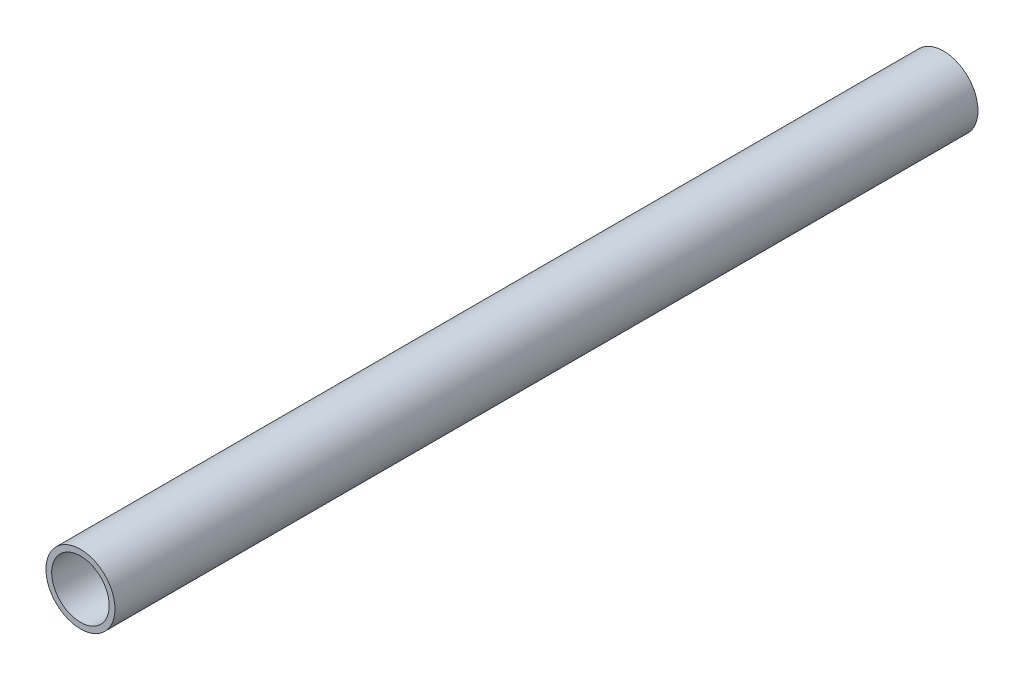
ISO-10303-21;
HEADER;
FILE_DESCRIPTION(('STEP AP214'),'2;1');
FILE_NAME('part.step','',(''),(''),'','','');
FILE_SCHEMA(('AUTOMOTIVE_DESIGN { 1 0 10303 214 1 1 1 1 }'));
ENDSEC;
DATA;
#1=APPLICATION_CONTEXT('core data for automotive mechanical design processes');
#2=APPLICATION_PROTOCOL_DEFINITION('international standard','automotive_design',2000,#1);
#3=PRODUCT_CONTEXT('',#1,'mechanical');
#4=PRODUCT('Part','Part','',(#3));
#5=PRODUCT_RELATED_PRODUCT_CATEGORY('part','',(#4));
#6=PRODUCT_DEFINITION_FORMATION('','',#4);
#7=PRODUCT_DEFINITION_CONTEXT('part definition',#1,'design');
#8=PRODUCT_DEFINITION('design','',#6,#7);
#9=PRODUCT_DEFINITION_SHAPE('','',#8);
#10=(LENGTH_UNIT() NAMED_UNIT(*) SI_UNIT(.MILLI.,.METRE.));
#11=(NAMED_UNIT(*) PLANE_ANGLE_UNIT() SI_UNIT($,.RADIAN.));
#12=(NAMED_UNIT(*) SI_UNIT($,.STERADIAN.) SOLID_ANGLE_UNIT());
#13=UNCERTAINTY_MEASURE_WITH_UNIT(LENGTH_MEASURE(1.E-05),#10,'distance_accuracy_value','');
#14=(GEOMETRIC_REPRESENTATION_CONTEXT(3) GLOBAL_UNCERTAINTY_ASSIGNED_CONTEXT((#13)) GLOBAL_UNIT_ASSIGNED_CONTEXT((#10,
#11,#12)) REPRESENTATION_CONTEXT('',''));
#15=CARTESIAN_POINT('',(0.,0.,0.));
#16=DIRECTION('',(0.,0.,1.));
#17=DIRECTION('',(1.,0.,0.));
#18=AXIS2_PLACEMENT_3D('',#15,#16,#17);
#19=CARTESIAN_POINT('',(0.,0.,150.));
#20=DIRECTION('',(0.,0.,1.));
#21=DIRECTION('',(1.,0.,0.));
#22=AXIS2_PLACEMENT_3D('',#19,#20,#21);
#23=PLANE('',#22);
#24=CARTESIAN_POINT('',(0.,0.,150.));
#25=DIRECTION('',(0.,0.,1.));
#26=DIRECTION('',(1.,0.,0.));
#27=AXIS2_PLACEMENT_3D('',#24,#25,#26);
#28=CIRCLE('',#27,6.);
#29=CARTESIAN_POINT('',(6.,0.,150.));
#30=VERTEX_POINT('',#29);
#31=EDGE_CURVE('E10',#30,#30,#28,.T.);
#32=ORIENTED_EDGE('',*,*,#31,.T.);
#33=EDGE_LOOP('',(#32));
#34=FACE_BOUND('',#33,.T.);
#35=CARTESIAN_POINT('',(0.,0.,150.));
#36=DIRECTION('',(0.,0.,1.));
#37=DIRECTION('',(1.,0.,0.));
#38=AXIS2_PLACEMENT_3D('',#35,#36,#37);
#39=CIRCLE('',#38,5.);
#40=CARTESIAN_POINT('',(5.,0.,150.));
#41=VERTEX_POINT('',#40);
#42=EDGE_CURVE('E50',#41,#41,#39,.T.);
#43=ORIENTED_EDGE('',*,*,#42,.F.);
#44=EDGE_LOOP('',(#43));
#45=FACE_BOUND('',#44,.T.);
#46=ADVANCED_FACE('F37',(#34,#45),#23,.T.);
#47=CARTESIAN_POINT('',(0.,0.,0.));
#48=DIRECTION('',(0.,0.,1.));
#49=DIRECTION('',(1.,0.,0.));
#50=AXIS2_PLACEMENT_3D('',#47,#48,#49);
#51=PLANE('',#50);
#52=CARTESIAN_POINT('',(0.,0.,0.));
#53=DIRECTION('',(0.,0.,1.));
#54=DIRECTION('',(1.,0.,0.));
#55=AXIS2_PLACEMENT_3D('',#52,#53,#54);
#56=CIRCLE('',#55,6.);
#57=CARTESIAN_POINT('',(6.,0.,0.));
#58=VERTEX_POINT('',#57);
#59=EDGE_CURVE('E41',#58,#58,#56,.T.);
#60=ORIENTED_EDGE('',*,*,#59,.F.);
#61=EDGE_LOOP('',(#60));
#62=FACE_BOUND('',#61,.T.);
#63=CARTESIAN_POINT('',(0.,0.,0.));
#64=DIRECTION('',(0.,0.,1.));
#65=DIRECTION('',(1.,0.,0.));
#66=AXIS2_PLACEMENT_3D('',#63,#64,#65);
#67=CIRCLE('',#66,5.);
#68=CARTESIAN_POINT('',(5.,0.,0.));
#69=VERTEX_POINT('',#68);
#70=EDGE_CURVE('E52',#69,#69,#67,.T.);
#71=ORIENTED_EDGE('',*,*,#70,.T.);
#72=EDGE_LOOP('',(#71));
#73=FACE_BOUND('',#72,.T.);
#74=ADVANCED_FACE('F64',(#62,#73),#51,.F.);
#75=CARTESIAN_POINT('',(0.,0.,150.));
#76=DIRECTION('',(0.,0.,-1.));
#77=DIRECTION('',(-1.,0.,0.));
#78=AXIS2_PLACEMENT_3D('',#75,#76,#77);
#79=CYLINDRICAL_SURFACE('',#78,6.);
#80=ORIENTED_EDGE('',*,*,#31,.F.);
#81=EDGE_LOOP('',(#80));
#82=FACE_BOUND('',#81,.T.);
#83=ORIENTED_EDGE('',*,*,#59,.T.);
#84=EDGE_LOOP('',(#83));
#85=FACE_BOUND('',#84,.T.);
#86=ADVANCED_FACE('F39',(#82,#85),#79,.T.);
#87=CARTESIAN_POINT('',(0.,0.,150.));
#88=DIRECTION('',(0.,0.,-1.));
#89=DIRECTION('',(-1.,0.,0.));
#90=AXIS2_PLACEMENT_3D('',#87,#88,#89);
#91=CYLINDRICAL_SURFACE('',#90,5.);
#92=ORIENTED_EDGE('',*,*,#42,.T.);
#93=EDGE_LOOP('',(#92));
#94=FACE_BOUND('',#93,.T.);
#95=ORIENTED_EDGE('',*,*,#70,.F.);
#96=EDGE_LOOP('',(#95));
#97=FACE_BOUND('',#96,.T.);
#98=ADVANCED_FACE('F60',(#94,#97),#91,.F.);
#99=CLOSED_SHELL('',(#46,#74,#86,#98));
#100=MANIFOLD_SOLID_BREP('B2',#99);
#101=ADVANCED_BREP_SHAPE_REPRESENTATION('',(#18,#100),#14);
#102=SHAPE_DEFINITION_REPRESENTATION(#9,#101);
ENDSEC;
END-ISO-10303-21;
